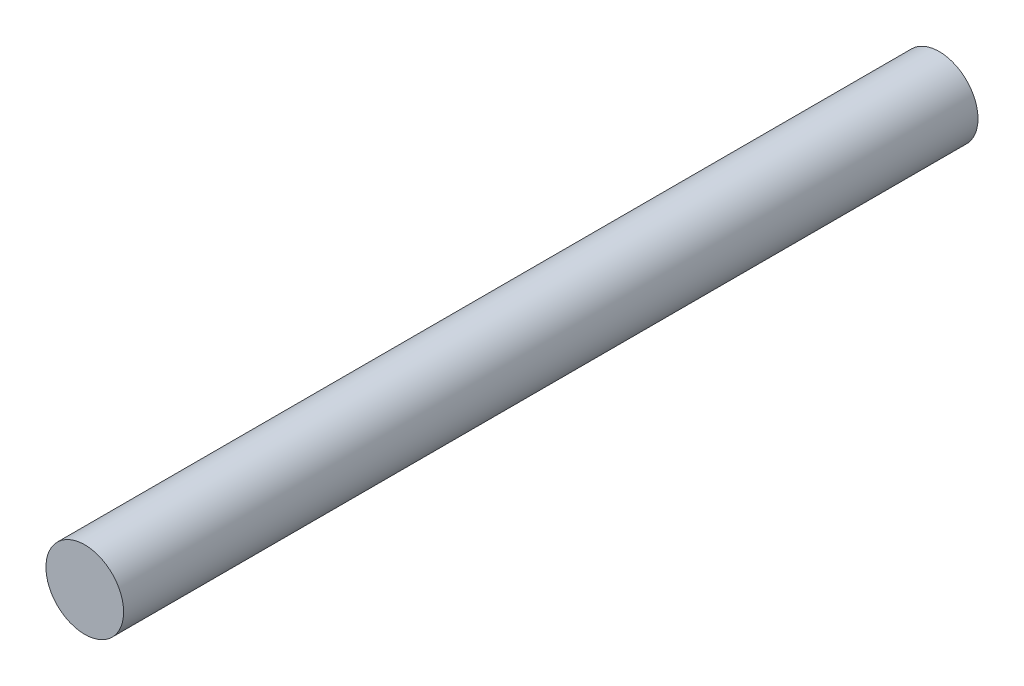
ISO-10303-21;
HEADER;
FILE_DESCRIPTION(('STEP AP214'),'2;1');
FILE_NAME('part.step','',(''),(''),'','','');
FILE_SCHEMA(('AUTOMOTIVE_DESIGN { 1 0 10303 214 1 1 1 1 }'));
ENDSEC;
DATA;
#1=APPLICATION_CONTEXT('core data for automotive mechanical design processes');
#2=APPLICATION_PROTOCOL_DEFINITION('international standard','automotive_design',2000,#1);
#3=PRODUCT_CONTEXT('',#1,'mechanical');
#4=PRODUCT('Part','Part','',(#3));
#5=PRODUCT_RELATED_PRODUCT_CATEGORY('part','',(#4));
#6=PRODUCT_DEFINITION_FORMATION('','',#4);
#7=PRODUCT_DEFINITION_CONTEXT('part definition',#1,'design');
#8=PRODUCT_DEFINITION('design','',#6,#7);
#9=PRODUCT_DEFINITION_SHAPE('','',#8);
#10=(LENGTH_UNIT() NAMED_UNIT(*) SI_UNIT(.MILLI.,.METRE.));
#11=(NAMED_UNIT(*) PLANE_ANGLE_UNIT() SI_UNIT($,.RADIAN.));
#12=(NAMED_UNIT(*) SI_UNIT($,.STERADIAN.) SOLID_ANGLE_UNIT());
#13=UNCERTAINTY_MEASURE_WITH_UNIT(LENGTH_MEASURE(1.E-05),#10,'distance_accuracy_value','');
#14=(GEOMETRIC_REPRESENTATION_CONTEXT(3) GLOBAL_UNCERTAINTY_ASSIGNED_CONTEXT((#13)) GLOBAL_UNIT_ASSIGNED_CONTEXT((#10,
#11,#12)) REPRESENTATION_CONTEXT('',''));
#15=CARTESIAN_POINT('',(0.,0.,0.));
#16=DIRECTION('',(0.,0.,1.));
#17=DIRECTION('',(1.,0.,0.));
#18=AXIS2_PLACEMENT_3D('',#15,#16,#17);
#19=CARTESIAN_POINT('',(0.,0.,55.));
#20=DIRECTION('',(0.,0.,-1.));
#21=DIRECTION('',(-1.,0.,0.));
#22=AXIS2_PLACEMENT_3D('',#19,#20,#21);
#23=CYLINDRICAL_SURFACE('',#22,2.5);
#24=CARTESIAN_POINT('',(0.,0.,55.));
#25=DIRECTION('',(0.,0.,1.));
#26=DIRECTION('',(1.,0.,0.));
#27=AXIS2_PLACEMENT_3D('',#24,#25,#26);
#28=CIRCLE('',#27,2.5);
#29=CARTESIAN_POINT('',(2.5,0.,55.));
#30=VERTEX_POINT('',#29);
#31=EDGE_CURVE('E10',#30,#30,#28,.T.);
#32=ORIENTED_EDGE('',*,*,#31,.F.);
#33=EDGE_LOOP('',(#32));
#34=FACE_BOUND('',#33,.T.);
#35=CARTESIAN_POINT('',(0.,0.,0.));
#36=DIRECTION('',(0.,0.,1.));
#37=DIRECTION('',(1.,0.,0.));
#38=AXIS2_PLACEMENT_3D('',#35,#36,#37);
#39=CIRCLE('',#38,2.5);
#40=CARTESIAN_POINT('',(2.5,0.,0.));
#41=VERTEX_POINT('',#40);
#42=EDGE_CURVE('E35',#41,#41,#39,.T.);
#43=ORIENTED_EDGE('',*,*,#42,.T.);
#44=EDGE_LOOP('',(#43));
#45=FACE_BOUND('',#44,.T.);
#46=ADVANCED_FACE('F32',(#34,#45),#23,.T.);
#47=CARTESIAN_POINT('',(0.,0.,55.));
#48=DIRECTION('',(0.,0.,1.));
#49=DIRECTION('',(1.,0.,0.));
#50=AXIS2_PLACEMENT_3D('',#47,#48,#49);
#51=PLANE('',#50);
#52=ORIENTED_EDGE('',*,*,#31,.T.);
#53=EDGE_LOOP('',(#52));
#54=FACE_BOUND('',#53,.T.);
#55=ADVANCED_FACE('F47',(#54),#51,.T.);
#56=CARTESIAN_POINT('',(0.,0.,0.));
#57=DIRECTION('',(0.,0.,1.));
#58=DIRECTION('',(1.,0.,0.));
#59=AXIS2_PLACEMENT_3D('',#56,#57,#58);
#60=PLANE('',#59);
#61=ORIENTED_EDGE('',*,*,#42,.F.);
#62=EDGE_LOOP('',(#61));
#63=FACE_BOUND('',#62,.T.);
#64=ADVANCED_FACE('F45',(#63),#60,.F.);
#65=CLOSED_SHELL('',(#46,#55,#64));
#66=MANIFOLD_SOLID_BREP('B2',#65);
#67=ADVANCED_BREP_SHAPE_REPRESENTATION('',(#18,#66),#14);
#68=SHAPE_DEFINITION_REPRESENTATION(#9,#67);
ENDSEC;
END-ISO-10303-21;
